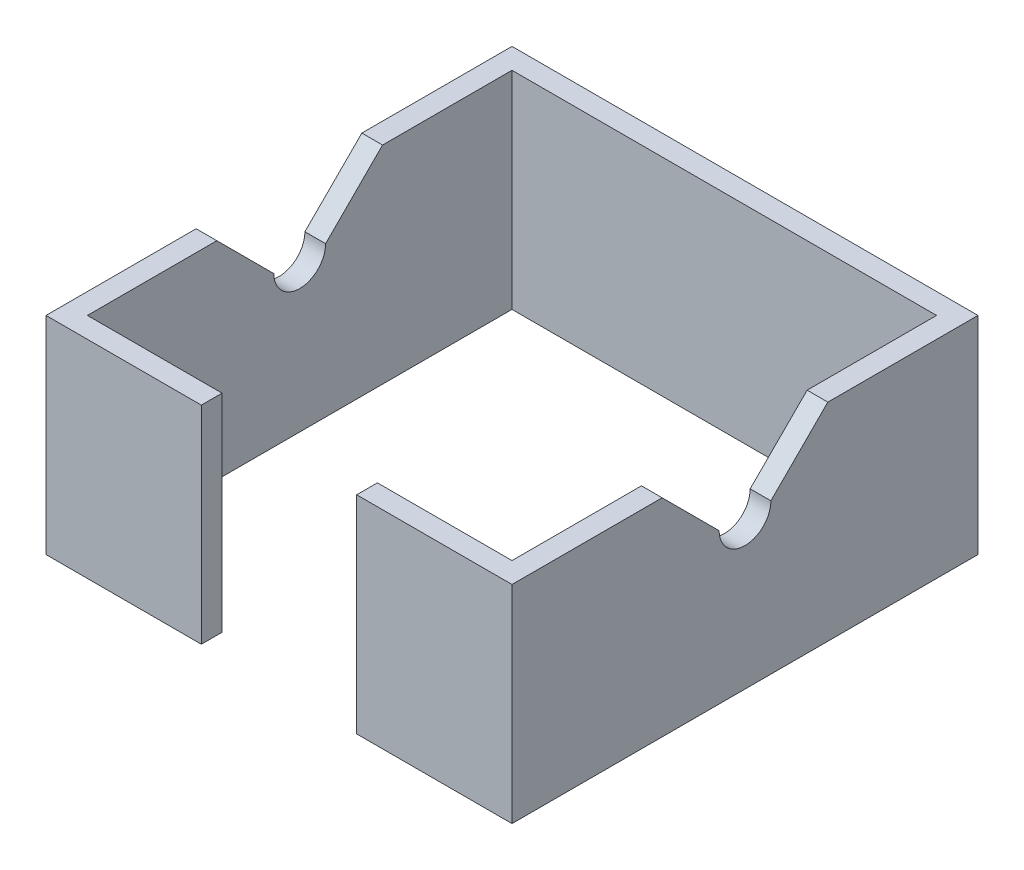
ISO-10303-21;
HEADER;
FILE_DESCRIPTION(('STEP AP214'),'2;1');
FILE_NAME('part.step','',(''),(''),'','','');
FILE_SCHEMA(('AUTOMOTIVE_DESIGN { 1 0 10303 214 1 1 1 1 }'));
ENDSEC;
DATA;
#1=APPLICATION_CONTEXT('core data for automotive mechanical design processes');
#2=APPLICATION_PROTOCOL_DEFINITION('international standard','automotive_design',2000,#1);
#3=PRODUCT_CONTEXT('',#1,'mechanical');
#4=PRODUCT('Part','Part','',(#3));
#5=PRODUCT_RELATED_PRODUCT_CATEGORY('part','',(#4));
#6=PRODUCT_DEFINITION_FORMATION('','',#4);
#7=PRODUCT_DEFINITION_CONTEXT('part definition',#1,'design');
#8=PRODUCT_DEFINITION('design','',#6,#7);
#9=PRODUCT_DEFINITION_SHAPE('','',#8);
#10=(LENGTH_UNIT() NAMED_UNIT(*) SI_UNIT(.MILLI.,.METRE.));
#11=(NAMED_UNIT(*) PLANE_ANGLE_UNIT() SI_UNIT($,.RADIAN.));
#12=(NAMED_UNIT(*) SI_UNIT($,.STERADIAN.) SOLID_ANGLE_UNIT());
#13=UNCERTAINTY_MEASURE_WITH_UNIT(LENGTH_MEASURE(1.E-05),#10,'distance_accuracy_value','');
#14=(GEOMETRIC_REPRESENTATION_CONTEXT(3) GLOBAL_UNCERTAINTY_ASSIGNED_CONTEXT((#13)) GLOBAL_UNIT_ASSIGNED_CONTEXT((#10,
#11,#12)) REPRESENTATION_CONTEXT('',''));
#15=CARTESIAN_POINT('',(0.,0.,0.));
#16=DIRECTION('',(0.,0.,1.));
#17=DIRECTION('',(1.,0.,0.));
#18=AXIS2_PLACEMENT_3D('',#15,#16,#17);
#19=CARTESIAN_POINT('',(0.,20.,0.));
#20=DIRECTION('',(0.,1.,0.));
#21=DIRECTION('',(0.,0.,1.));
#22=AXIS2_PLACEMENT_3D('',#19,#20,#21);
#23=PLANE('',#22);
#24=DIRECTION('',(0.,0.,1.));
#25=VECTOR('',#24,1.);
#26=CARTESIAN_POINT('',(0.,20.,0.));
#27=LINE('',#26,#25);
#28=CARTESIAN_POINT('',(0.,20.,0.));
#29=VERTEX_POINT('',#28);
#30=CARTESIAN_POINT('',(0.,20.,14.4999999999999));
#31=VERTEX_POINT('',#30);
#32=EDGE_CURVE('E174',#29,#31,#27,.T.);
#33=ORIENTED_EDGE('',*,*,#32,.T.);
#34=DIRECTION('',(-1.,0.,0.));
#35=VECTOR('',#34,1.);
#36=CARTESIAN_POINT('',(45.,20.,14.4999999999999));
#37=LINE('',#36,#35);
#38=CARTESIAN_POINT('',(2.,20.,14.4999999999999));
#39=VERTEX_POINT('',#38);
#40=EDGE_CURVE('E244',#39,#31,#37,.T.);
#41=ORIENTED_EDGE('',*,*,#40,.F.);
#42=DIRECTION('',(0.,0.,1.));
#43=VECTOR('',#42,1.);
#44=CARTESIAN_POINT('',(2.,20.,2.));
#45=LINE('',#44,#43);
#46=CARTESIAN_POINT('',(2.,20.,2.));
#47=VERTEX_POINT('',#46);
#48=EDGE_CURVE('E134',#47,#39,#45,.T.);
#49=ORIENTED_EDGE('',*,*,#48,.F.);
#50=DIRECTION('',(-1.,0.,0.));
#51=VECTOR('',#50,1.);
#52=CARTESIAN_POINT('',(2.,20.,2.));
#53=LINE('',#52,#51);
#54=CARTESIAN_POINT('',(43.,20.,2.));
#55=VERTEX_POINT('',#54);
#56=EDGE_CURVE('E146',#55,#47,#53,.T.);
#57=ORIENTED_EDGE('',*,*,#56,.F.);
#58=DIRECTION('',(0.,0.,-1.));
#59=VECTOR('',#58,1.);
#60=CARTESIAN_POINT('',(43.,20.,2.));
#61=LINE('',#60,#59);
#62=CARTESIAN_POINT('',(43.,20.,14.4999999999999));
#63=VERTEX_POINT('',#62);
#64=EDGE_CURVE('E142',#63,#55,#61,.T.);
#65=ORIENTED_EDGE('',*,*,#64,.F.);
#66=CARTESIAN_POINT('',(45.,20.,14.4999999999999));
#67=VERTEX_POINT('',#66);
#68=EDGE_CURVE('E246',#67,#63,#37,.T.);
#69=ORIENTED_EDGE('',*,*,#68,.F.);
#70=DIRECTION('',(0.,0.,-1.));
#71=VECTOR('',#70,1.);
#72=CARTESIAN_POINT('',(45.,20.,0.));
#73=LINE('',#72,#71);
#74=CARTESIAN_POINT('',(45.,20.,0.));
#75=VERTEX_POINT('',#74);
#76=EDGE_CURVE('E181',#67,#75,#73,.T.);
#77=ORIENTED_EDGE('',*,*,#76,.T.);
#78=DIRECTION('',(-1.,0.,0.));
#79=VECTOR('',#78,1.);
#80=CARTESIAN_POINT('',(0.,20.,0.));
#81=LINE('',#80,#79);
#82=EDGE_CURVE('E185',#75,#29,#81,.T.);
#83=ORIENTED_EDGE('',*,*,#82,.T.);
#84=EDGE_LOOP('',(#33,#41,#49,#57,#65,#69,#77,#83));
#85=FACE_BOUND('',#84,.T.);
#86=ADVANCED_FACE('F39',(#85),#23,.T.);
#87=DIRECTION('',(-1.,0.,0.));
#88=VECTOR('',#87,1.);
#89=CARTESIAN_POINT('',(45.,20.,30.5));
#90=LINE('',#89,#88);
#91=CARTESIAN_POINT('',(2.,20.,30.5000000000001));
#92=VERTEX_POINT('',#91);
#93=CARTESIAN_POINT('',(0.,20.,30.5));
#94=VERTEX_POINT('',#93);
#95=EDGE_CURVE('E57',#92,#94,#90,.T.);
#96=ORIENTED_EDGE('',*,*,#95,.T.);
#97=CARTESIAN_POINT('',(0.,20.,45.));
#98=VERTEX_POINT('',#97);
#99=EDGE_CURVE('E100',#94,#98,#27,.T.);
#100=ORIENTED_EDGE('',*,*,#99,.T.);
#101=DIRECTION('',(1.,0.,0.));
#102=VECTOR('',#101,1.);
#103=CARTESIAN_POINT('',(0.,20.,45.));
#104=LINE('',#103,#102);
#105=CARTESIAN_POINT('',(15.,20.,45.));
#106=VERTEX_POINT('',#105);
#107=EDGE_CURVE('E178',#98,#106,#104,.T.);
#108=ORIENTED_EDGE('',*,*,#107,.T.);
#109=DIRECTION('',(0.,0.,1.));
#110=VECTOR('',#109,1.);
#111=CARTESIAN_POINT('',(15.,20.,-0.001000000000001));
#112=LINE('',#111,#110);
#113=CARTESIAN_POINT('',(15.,20.,43.));
#114=VERTEX_POINT('',#113);
#115=EDGE_CURVE('E117',#114,#106,#112,.T.);
#116=ORIENTED_EDGE('',*,*,#115,.F.);
#117=DIRECTION('',(1.,0.,0.));
#118=VECTOR('',#117,1.);
#119=CARTESIAN_POINT('',(2.00000000000001,20.,43.));
#120=LINE('',#119,#118);
#121=CARTESIAN_POINT('',(2.00000000000001,20.,43.));
#122=VERTEX_POINT('',#121);
#123=EDGE_CURVE('E139',#122,#114,#120,.T.);
#124=ORIENTED_EDGE('',*,*,#123,.F.);
#125=EDGE_CURVE('E138',#92,#122,#45,.T.);
#126=ORIENTED_EDGE('',*,*,#125,.F.);
#127=EDGE_LOOP('',(#96,#100,#108,#116,#124,#126));
#128=FACE_BOUND('',#127,.T.);
#129=ADVANCED_FACE('F361',(#128),#23,.T.);
#130=CARTESIAN_POINT('',(0.,20.,0.));
#131=DIRECTION('',(1.,0.,0.));
#132=DIRECTION('',(0.,0.,-1.));
#133=AXIS2_PLACEMENT_3D('',#130,#131,#132);
#134=PLANE('',#133);
#135=DIRECTION('',(0.,-0.707106781186544,0.707106781186551));
#136=VECTOR('',#135,1.);
#137=CARTESIAN_POINT('',(0.,27.25,7.2499999999999));
#138=LINE('',#137,#136);
#139=CARTESIAN_POINT('',(0.,14.5,20.));
#140=VERTEX_POINT('',#139);
#141=EDGE_CURVE('E70',#31,#140,#138,.T.);
#142=ORIENTED_EDGE('',*,*,#141,.F.);
#143=ORIENTED_EDGE('',*,*,#32,.F.);
#144=DIRECTION('',(0.,-1.,0.));
#145=VECTOR('',#144,1.);
#146=CARTESIAN_POINT('',(0.,20.,0.));
#147=LINE('',#146,#145);
#148=CARTESIAN_POINT('',(0.,0.,0.));
#149=VERTEX_POINT('',#148);
#150=EDGE_CURVE('E188',#29,#149,#147,.T.);
#151=ORIENTED_EDGE('',*,*,#150,.T.);
#152=DIRECTION('',(0.,0.,1.));
#153=VECTOR('',#152,1.);
#154=CARTESIAN_POINT('',(0.,0.,0.));
#155=LINE('',#154,#153);
#156=CARTESIAN_POINT('',(0.,0.,45.));
#157=VERTEX_POINT('',#156);
#158=EDGE_CURVE('E173',#149,#157,#155,.T.);
#159=ORIENTED_EDGE('',*,*,#158,.T.);
#160=DIRECTION('',(0.,-1.,0.));
#161=VECTOR('',#160,1.);
#162=CARTESIAN_POINT('',(0.,20.,45.));
#163=LINE('',#162,#161);
#164=EDGE_CURVE('E209',#98,#157,#163,.T.);
#165=ORIENTED_EDGE('',*,*,#164,.F.);
#166=ORIENTED_EDGE('',*,*,#99,.F.);
#167=DIRECTION('',(0.,-0.707106781186544,-0.707106781186551));
#168=VECTOR('',#167,1.);
#169=CARTESIAN_POINT('',(0.,4.74999999999998,15.2499999999999));
#170=LINE('',#169,#168);
#171=CARTESIAN_POINT('',(0.,14.5,25.));
#172=VERTEX_POINT('',#171);
#173=EDGE_CURVE('E82',#94,#172,#170,.T.);
#174=ORIENTED_EDGE('',*,*,#173,.T.);
#175=CARTESIAN_POINT('',(0.,14.5,22.5));
#176=DIRECTION('',(-1.,0.,0.));
#177=DIRECTION('',(0.,0.,1.));
#178=AXIS2_PLACEMENT_3D('',#175,#176,#177);
#179=CIRCLE('',#178,2.5);
#180=EDGE_CURVE('E43',#140,#172,#179,.T.);
#181=ORIENTED_EDGE('',*,*,#180,.F.);
#182=EDGE_LOOP('',(#142,#143,#151,#159,#165,#166,#174,#181));
#183=FACE_BOUND('',#182,.T.);
#184=ADVANCED_FACE('F41',(#183),#134,.F.);
#185=CARTESIAN_POINT('',(45.,20.,0.));
#186=DIRECTION('',(-1.,0.,0.));
#187=DIRECTION('',(0.,0.,1.));
#188=AXIS2_PLACEMENT_3D('',#185,#186,#187);
#189=PLANE('',#188);
#190=DIRECTION('',(0.,0.707106781186544,-0.707106781186551));
#191=VECTOR('',#190,1.);
#192=CARTESIAN_POINT('',(45.,17.2500000000001,17.2499999999999));
#193=LINE('',#192,#191);
#194=CARTESIAN_POINT('',(45.,14.5,20.));
#195=VERTEX_POINT('',#194);
#196=EDGE_CURVE('E89',#195,#67,#193,.T.);
#197=ORIENTED_EDGE('',*,*,#196,.F.);
#198=CARTESIAN_POINT('',(45.,14.5,22.5));
#199=DIRECTION('',(-1.,0.,0.));
#200=DIRECTION('',(0.,0.,1.));
#201=AXIS2_PLACEMENT_3D('',#198,#199,#200);
#202=CIRCLE('',#201,2.5);
#203=CARTESIAN_POINT('',(45.,14.5,25.));
#204=VERTEX_POINT('',#203);
#205=EDGE_CURVE('E380',#195,#204,#202,.T.);
#206=ORIENTED_EDGE('',*,*,#205,.T.);
#207=DIRECTION('',(0.,0.707106781186544,0.707106781186551));
#208=VECTOR('',#207,1.);
#209=CARTESIAN_POINT('',(45.,-5.24999999999994,5.24999999999988));
#210=LINE('',#209,#208);
#211=CARTESIAN_POINT('',(45.,20.,30.5));
#212=VERTEX_POINT('',#211);
#213=EDGE_CURVE('E379',#204,#212,#210,.T.);
#214=ORIENTED_EDGE('',*,*,#213,.T.);
#215=CARTESIAN_POINT('',(45.,20.,45.));
#216=VERTEX_POINT('',#215);
#217=EDGE_CURVE('E182',#216,#212,#73,.T.);
#218=ORIENTED_EDGE('',*,*,#217,.F.);
#219=DIRECTION('',(0.,-1.,0.));
#220=VECTOR('',#219,1.);
#221=CARTESIAN_POINT('',(45.,20.,45.));
#222=LINE('',#221,#220);
#223=CARTESIAN_POINT('',(45.,0.,45.));
#224=VERTEX_POINT('',#223);
#225=EDGE_CURVE('E206',#216,#224,#222,.T.);
#226=ORIENTED_EDGE('',*,*,#225,.T.);
#227=DIRECTION('',(0.,0.,-1.));
#228=VECTOR('',#227,1.);
#229=CARTESIAN_POINT('',(45.,0.,0.));
#230=LINE('',#229,#228);
#231=CARTESIAN_POINT('',(45.,0.,0.));
#232=VERTEX_POINT('',#231);
#233=EDGE_CURVE('E195',#224,#232,#230,.T.);
#234=ORIENTED_EDGE('',*,*,#233,.T.);
#235=DIRECTION('',(0.,-1.,0.));
#236=VECTOR('',#235,1.);
#237=CARTESIAN_POINT('',(45.,20.,0.));
#238=LINE('',#237,#236);
#239=EDGE_CURVE('E203',#75,#232,#238,.T.);
#240=ORIENTED_EDGE('',*,*,#239,.F.);
#241=ORIENTED_EDGE('',*,*,#76,.F.);
#242=EDGE_LOOP('',(#197,#206,#214,#218,#226,#234,#240,#241));
#243=FACE_BOUND('',#242,.T.);
#244=ADVANCED_FACE('F377',(#243),#189,.F.);
#245=CARTESIAN_POINT('',(2.,20.,2.));
#246=DIRECTION('',(1.,0.,0.));
#247=DIRECTION('',(0.,0.,-1.));
#248=AXIS2_PLACEMENT_3D('',#245,#246,#247);
#249=PLANE('',#248);
#250=ORIENTED_EDGE('',*,*,#48,.T.);
#251=DIRECTION('',(0.,-0.707106781186544,0.707106781186551));
#252=VECTOR('',#251,1.);
#253=CARTESIAN_POINT('',(2.,26.25,8.24999999999991));
#254=LINE('',#253,#252);
#255=CARTESIAN_POINT('',(2.,14.5,20.));
#256=VERTEX_POINT('',#255);
#257=EDGE_CURVE('E101',#39,#256,#254,.T.);
#258=ORIENTED_EDGE('',*,*,#257,.T.);
#259=CARTESIAN_POINT('',(2.,14.5,22.5));
#260=DIRECTION('',(1.,0.,0.));
#261=DIRECTION('',(0.,0.,-1.));
#262=AXIS2_PLACEMENT_3D('',#259,#260,#261);
#263=CIRCLE('',#262,2.5);
#264=CARTESIAN_POINT('',(2.,14.5,25.));
#265=VERTEX_POINT('',#264);
#266=EDGE_CURVE('E96',#265,#256,#263,.T.);
#267=ORIENTED_EDGE('',*,*,#266,.F.);
#268=DIRECTION('',(0.,-0.707106781186544,-0.707106781186551));
#269=VECTOR('',#268,1.);
#270=CARTESIAN_POINT('',(2.,5.74999999999998,16.2499999999999));
#271=LINE('',#270,#269);
#272=EDGE_CURVE('E84',#92,#265,#271,.T.);
#273=ORIENTED_EDGE('',*,*,#272,.F.);
#274=ORIENTED_EDGE('',*,*,#125,.T.);
#275=DIRECTION('',(0.,-1.,0.));
#276=VECTOR('',#275,1.);
#277=CARTESIAN_POINT('',(2.00000000000001,20.,43.));
#278=LINE('',#277,#276);
#279=CARTESIAN_POINT('',(2.00000000000001,0.,43.));
#280=VERTEX_POINT('',#279);
#281=EDGE_CURVE('E170',#122,#280,#278,.T.);
#282=ORIENTED_EDGE('',*,*,#281,.T.);
#283=DIRECTION('',(0.,0.,1.));
#284=VECTOR('',#283,1.);
#285=CARTESIAN_POINT('',(2.,0.,2.));
#286=LINE('',#285,#284);
#287=CARTESIAN_POINT('',(2.,0.,2.));
#288=VERTEX_POINT('',#287);
#289=EDGE_CURVE('E113',#288,#280,#286,.T.);
#290=ORIENTED_EDGE('',*,*,#289,.F.);
#291=DIRECTION('',(0.,-1.,0.));
#292=VECTOR('',#291,1.);
#293=CARTESIAN_POINT('',(2.,20.,2.));
#294=LINE('',#293,#292);
#295=EDGE_CURVE('E149',#47,#288,#294,.T.);
#296=ORIENTED_EDGE('',*,*,#295,.F.);
#297=EDGE_LOOP('',(#250,#258,#267,#273,#274,#282,#290,#296));
#298=FACE_BOUND('',#297,.T.);
#299=ADVANCED_FACE('F287',(#298),#249,.T.);
#300=CARTESIAN_POINT('',(43.,20.,2.));
#301=DIRECTION('',(-1.,0.,0.));
#302=DIRECTION('',(0.,0.,1.));
#303=AXIS2_PLACEMENT_3D('',#300,#301,#302);
#304=PLANE('',#303);
#305=CARTESIAN_POINT('',(43.,14.5,22.5));
#306=DIRECTION('',(-1.,0.,0.));
#307=DIRECTION('',(0.,0.,1.));
#308=AXIS2_PLACEMENT_3D('',#305,#306,#307);
#309=CIRCLE('',#308,2.5);
#310=CARTESIAN_POINT('',(43.,14.5,20.));
#311=VERTEX_POINT('',#310);
#312=CARTESIAN_POINT('',(43.,14.5,25.));
#313=VERTEX_POINT('',#312);
#314=EDGE_CURVE('E49',#311,#313,#309,.T.);
#315=ORIENTED_EDGE('',*,*,#314,.F.);
#316=DIRECTION('',(0.,0.707106781186544,-0.707106781186551));
#317=VECTOR('',#316,1.);
#318=CARTESIAN_POINT('',(43.,26.25,8.2499999999999));
#319=LINE('',#318,#317);
#320=EDGE_CURVE('E11',#311,#63,#319,.T.);
#321=ORIENTED_EDGE('',*,*,#320,.T.);
#322=ORIENTED_EDGE('',*,*,#64,.T.);
#323=DIRECTION('',(0.,-1.,0.));
#324=VECTOR('',#323,1.);
#325=CARTESIAN_POINT('',(43.,20.,2.));
#326=LINE('',#325,#324);
#327=CARTESIAN_POINT('',(43.,0.,2.));
#328=VERTEX_POINT('',#327);
#329=EDGE_CURVE('E164',#55,#328,#326,.T.);
#330=ORIENTED_EDGE('',*,*,#329,.T.);
#331=DIRECTION('',(0.,0.,-1.));
#332=VECTOR('',#331,1.);
#333=CARTESIAN_POINT('',(43.,0.,2.));
#334=LINE('',#333,#332);
#335=CARTESIAN_POINT('',(43.,0.,43.));
#336=VERTEX_POINT('',#335);
#337=EDGE_CURVE('E156',#336,#328,#334,.T.);
#338=ORIENTED_EDGE('',*,*,#337,.F.);
#339=DIRECTION('',(0.,-1.,0.));
#340=VECTOR('',#339,1.);
#341=CARTESIAN_POINT('',(43.,20.,43.));
#342=LINE('',#341,#340);
#343=CARTESIAN_POINT('',(43.,20.,43.));
#344=VERTEX_POINT('',#343);
#345=EDGE_CURVE('E167',#344,#336,#342,.T.);
#346=ORIENTED_EDGE('',*,*,#345,.F.);
#347=CARTESIAN_POINT('',(43.,20.,30.5));
#348=VERTEX_POINT('',#347);
#349=EDGE_CURVE('E143',#344,#348,#61,.T.);
#350=ORIENTED_EDGE('',*,*,#349,.T.);
#351=DIRECTION('',(0.,0.707106781186544,0.707106781186551));
#352=VECTOR('',#351,1.);
#353=CARTESIAN_POINT('',(43.,5.74999999999998,16.2499999999999));
#354=LINE('',#353,#352);
#355=EDGE_CURVE('E212',#313,#348,#354,.T.);
#356=ORIENTED_EDGE('',*,*,#355,.F.);
#357=EDGE_LOOP('',(#315,#321,#322,#330,#338,#346,#350,#356));
#358=FACE_BOUND('',#357,.T.);
#359=ADVANCED_FACE('F226',(#358),#304,.T.);
#360=CARTESIAN_POINT('',(0.,20.,45.));
#361=DIRECTION('',(0.,0.,-1.));
#362=DIRECTION('',(-1.,0.,0.));
#363=AXIS2_PLACEMENT_3D('',#360,#361,#362);
#364=PLANE('',#363);
#365=CARTESIAN_POINT('',(30.,20.,45.));
#366=VERTEX_POINT('',#365);
#367=EDGE_CURVE('E177',#366,#216,#104,.T.);
#368=ORIENTED_EDGE('',*,*,#367,.F.);
#369=DIRECTION('',(0.,1.,0.));
#370=VECTOR('',#369,1.);
#371=CARTESIAN_POINT('',(30.,20.,45.));
#372=LINE('',#371,#370);
#373=CARTESIAN_POINT('',(30.,0.,45.));
#374=VERTEX_POINT('',#373);
#375=EDGE_CURVE('E114',#374,#366,#372,.T.);
#376=ORIENTED_EDGE('',*,*,#375,.F.);
#377=DIRECTION('',(1.,0.,0.));
#378=VECTOR('',#377,1.);
#379=CARTESIAN_POINT('',(0.,0.,45.));
#380=LINE('',#379,#378);
#381=EDGE_CURVE('E191',#374,#224,#380,.T.);
#382=ORIENTED_EDGE('',*,*,#381,.T.);
#383=ORIENTED_EDGE('',*,*,#225,.F.);
#384=EDGE_LOOP('',(#368,#376,#382,#383));
#385=FACE_BOUND('',#384,.T.);
#386=ADVANCED_FACE('F348',(#385),#364,.F.);
#387=CARTESIAN_POINT('',(2.00000000000001,20.,43.));
#388=DIRECTION('',(0.,0.,-1.));
#389=DIRECTION('',(-1.,0.,0.));
#390=AXIS2_PLACEMENT_3D('',#387,#388,#389);
#391=PLANE('',#390);
#392=DIRECTION('',(0.,1.,0.));
#393=VECTOR('',#392,1.);
#394=CARTESIAN_POINT('',(30.,20.,43.));
#395=LINE('',#394,#393);
#396=CARTESIAN_POINT('',(30.,0.,43.));
#397=VERTEX_POINT('',#396);
#398=CARTESIAN_POINT('',(30.,20.,43.));
#399=VERTEX_POINT('',#398);
#400=EDGE_CURVE('E95',#397,#399,#395,.T.);
#401=ORIENTED_EDGE('',*,*,#400,.T.);
#402=EDGE_CURVE('E137',#399,#344,#120,.T.);
#403=ORIENTED_EDGE('',*,*,#402,.T.);
#404=ORIENTED_EDGE('',*,*,#345,.T.);
#405=DIRECTION('',(1.,0.,0.));
#406=VECTOR('',#405,1.);
#407=CARTESIAN_POINT('',(2.00000000000001,0.,43.));
#408=LINE('',#407,#406);
#409=EDGE_CURVE('E152',#397,#336,#408,.T.);
#410=ORIENTED_EDGE('',*,*,#409,.F.);
#411=EDGE_LOOP('',(#401,#403,#404,#410));
#412=FACE_BOUND('',#411,.T.);
#413=ADVANCED_FACE('F339',(#412),#391,.T.);
#414=EDGE_CURVE('E234',#212,#348,#90,.T.);
#415=ORIENTED_EDGE('',*,*,#414,.T.);
#416=ORIENTED_EDGE('',*,*,#349,.F.);
#417=ORIENTED_EDGE('',*,*,#402,.F.);
#418=DIRECTION('',(0.,0.,1.));
#419=VECTOR('',#418,1.);
#420=CARTESIAN_POINT('',(30.,20.,-0.001000000000001));
#421=LINE('',#420,#419);
#422=EDGE_CURVE('E120',#399,#366,#421,.T.);
#423=ORIENTED_EDGE('',*,*,#422,.T.);
#424=ORIENTED_EDGE('',*,*,#367,.T.);
#425=ORIENTED_EDGE('',*,*,#217,.T.);
#426=EDGE_LOOP('',(#415,#416,#417,#423,#424,#425));
#427=FACE_BOUND('',#426,.T.);
#428=ADVANCED_FACE('F239',(#427),#23,.T.);
#429=CARTESIAN_POINT('',(0.,0.,0.));
#430=DIRECTION('',(0.,1.,0.));
#431=DIRECTION('',(0.,0.,1.));
#432=AXIS2_PLACEMENT_3D('',#429,#430,#431);
#433=PLANE('',#432);
#434=ORIENTED_EDGE('',*,*,#381,.F.);
#435=DIRECTION('',(0.,0.,1.));
#436=VECTOR('',#435,1.);
#437=CARTESIAN_POINT('',(30.,0.,-0.001000000000001));
#438=LINE('',#437,#436);
#439=EDGE_CURVE('E125',#397,#374,#438,.T.);
#440=ORIENTED_EDGE('',*,*,#439,.F.);
#441=ORIENTED_EDGE('',*,*,#409,.T.);
#442=ORIENTED_EDGE('',*,*,#337,.T.);
#443=DIRECTION('',(-1.,0.,0.));
#444=VECTOR('',#443,1.);
#445=CARTESIAN_POINT('',(2.,0.,2.));
#446=LINE('',#445,#444);
#447=EDGE_CURVE('E159',#328,#288,#446,.T.);
#448=ORIENTED_EDGE('',*,*,#447,.T.);
#449=ORIENTED_EDGE('',*,*,#289,.T.);
#450=CARTESIAN_POINT('',(15.,0.,43.));
#451=VERTEX_POINT('',#450);
#452=EDGE_CURVE('E153',#280,#451,#408,.T.);
#453=ORIENTED_EDGE('',*,*,#452,.T.);
#454=DIRECTION('',(0.,0.,1.));
#455=VECTOR('',#454,1.);
#456=CARTESIAN_POINT('',(15.,0.,-0.001000000000001));
#457=LINE('',#456,#455);
#458=CARTESIAN_POINT('',(15.,0.,45.));
#459=VERTEX_POINT('',#458);
#460=EDGE_CURVE('E124',#451,#459,#457,.T.);
#461=ORIENTED_EDGE('',*,*,#460,.T.);
#462=EDGE_CURVE('E192',#157,#459,#380,.T.);
#463=ORIENTED_EDGE('',*,*,#462,.F.);
#464=ORIENTED_EDGE('',*,*,#158,.F.);
#465=DIRECTION('',(-1.,0.,0.));
#466=VECTOR('',#465,1.);
#467=CARTESIAN_POINT('',(0.,0.,0.));
#468=LINE('',#467,#466);
#469=EDGE_CURVE('E198',#232,#149,#468,.T.);
#470=ORIENTED_EDGE('',*,*,#469,.F.);
#471=ORIENTED_EDGE('',*,*,#233,.F.);
#472=EDGE_LOOP('',(#434,#440,#441,#442,#448,#449,#453,#461,#463,#464,#470,#471));
#473=FACE_BOUND('',#472,.T.);
#474=ADVANCED_FACE('F295',(#473),#433,.F.);
#475=ORIENTED_EDGE('',*,*,#462,.T.);
#476=DIRECTION('',(0.,-1.,0.));
#477=VECTOR('',#476,1.);
#478=CARTESIAN_POINT('',(15.,20.,45.));
#479=LINE('',#478,#477);
#480=EDGE_CURVE('E110',#106,#459,#479,.T.);
#481=ORIENTED_EDGE('',*,*,#480,.F.);
#482=ORIENTED_EDGE('',*,*,#107,.F.);
#483=ORIENTED_EDGE('',*,*,#164,.T.);
#484=EDGE_LOOP('',(#475,#481,#482,#483));
#485=FACE_BOUND('',#484,.T.);
#486=ADVANCED_FACE('F367',(#485),#364,.F.);
#487=CARTESIAN_POINT('',(0.,20.,0.));
#488=DIRECTION('',(0.,0.,1.));
#489=DIRECTION('',(1.,0.,0.));
#490=AXIS2_PLACEMENT_3D('',#487,#488,#489);
#491=PLANE('',#490);
#492=ORIENTED_EDGE('',*,*,#469,.T.);
#493=ORIENTED_EDGE('',*,*,#150,.F.);
#494=ORIENTED_EDGE('',*,*,#82,.F.);
#495=ORIENTED_EDGE('',*,*,#239,.T.);
#496=EDGE_LOOP('',(#492,#493,#494,#495));
#497=FACE_BOUND('',#496,.T.);
#498=ADVANCED_FACE('F374',(#497),#491,.F.);
#499=DIRECTION('',(0.,-1.,0.));
#500=VECTOR('',#499,1.);
#501=CARTESIAN_POINT('',(15.,20.,43.));
#502=LINE('',#501,#500);
#503=EDGE_CURVE('E121',#114,#451,#502,.T.);
#504=ORIENTED_EDGE('',*,*,#503,.T.);
#505=ORIENTED_EDGE('',*,*,#452,.F.);
#506=ORIENTED_EDGE('',*,*,#281,.F.);
#507=ORIENTED_EDGE('',*,*,#123,.T.);
#508=EDGE_LOOP('',(#504,#505,#506,#507));
#509=FACE_BOUND('',#508,.T.);
#510=ADVANCED_FACE('F359',(#509),#391,.T.);
#511=CARTESIAN_POINT('',(2.,20.,2.));
#512=DIRECTION('',(0.,0.,1.));
#513=DIRECTION('',(1.,0.,0.));
#514=AXIS2_PLACEMENT_3D('',#511,#512,#513);
#515=PLANE('',#514);
#516=ORIENTED_EDGE('',*,*,#447,.F.);
#517=ORIENTED_EDGE('',*,*,#329,.F.);
#518=ORIENTED_EDGE('',*,*,#56,.T.);
#519=ORIENTED_EDGE('',*,*,#295,.T.);
#520=EDGE_LOOP('',(#516,#517,#518,#519));
#521=FACE_BOUND('',#520,.T.);
#522=ADVANCED_FACE('F282',(#521),#515,.T.);
#523=CARTESIAN_POINT('',(15.,20.,-0.001000000000001));
#524=DIRECTION('',(-1.,0.,0.));
#525=DIRECTION('',(0.,0.,1.));
#526=AXIS2_PLACEMENT_3D('',#523,#524,#525);
#527=PLANE('',#526);
#528=ORIENTED_EDGE('',*,*,#115,.T.);
#529=ORIENTED_EDGE('',*,*,#480,.T.);
#530=ORIENTED_EDGE('',*,*,#460,.F.);
#531=ORIENTED_EDGE('',*,*,#503,.F.);
#532=EDGE_LOOP('',(#528,#529,#530,#531));
#533=FACE_BOUND('',#532,.T.);
#534=ADVANCED_FACE('F365',(#533),#527,.F.);
#535=CARTESIAN_POINT('',(30.,20.,-0.001000000000001));
#536=DIRECTION('',(1.,0.,0.));
#537=DIRECTION('',(0.,0.,-1.));
#538=AXIS2_PLACEMENT_3D('',#535,#536,#537);
#539=PLANE('',#538);
#540=ORIENTED_EDGE('',*,*,#439,.T.);
#541=ORIENTED_EDGE('',*,*,#375,.T.);
#542=ORIENTED_EDGE('',*,*,#422,.F.);
#543=ORIENTED_EDGE('',*,*,#400,.F.);
#544=EDGE_LOOP('',(#540,#541,#542,#543));
#545=FACE_BOUND('',#544,.T.);
#546=ADVANCED_FACE('F331',(#545),#539,.F.);
#547=CARTESIAN_POINT('',(45.,-5.24999999999994,5.24999999999988));
#548=DIRECTION('',(0.,-0.707106781186551,0.707106781186544));
#549=DIRECTION('',(0.,-0.707106781186544,-0.707106781186551));
#550=AXIS2_PLACEMENT_3D('',#547,#548,#549);
#551=PLANE('',#550);
#552=ORIENTED_EDGE('',*,*,#355,.T.);
#553=ORIENTED_EDGE('',*,*,#414,.F.);
#554=ORIENTED_EDGE('',*,*,#213,.F.);
#555=DIRECTION('',(-1.,0.,0.));
#556=VECTOR('',#555,1.);
#557=CARTESIAN_POINT('',(45.,14.5,25.));
#558=LINE('',#557,#556);
#559=EDGE_CURVE('E88',#204,#313,#558,.T.);
#560=ORIENTED_EDGE('',*,*,#559,.T.);
#561=EDGE_LOOP('',(#552,#553,#554,#560));
#562=FACE_BOUND('',#561,.T.);
#563=ADVANCED_FACE('F233',(#562),#551,.F.);
#564=CARTESIAN_POINT('',(45.,17.2500000000001,17.2499999999999));
#565=DIRECTION('',(0.,0.707106781186551,0.707106781186544));
#566=DIRECTION('',(0.,-0.707106781186544,0.707106781186551));
#567=AXIS2_PLACEMENT_3D('',#564,#565,#566);
#568=PLANE('',#567);
#569=DIRECTION('',(-1.,0.,0.));
#570=VECTOR('',#569,1.);
#571=CARTESIAN_POINT('',(45.,14.5,20.));
#572=LINE('',#571,#570);
#573=EDGE_CURVE('E105',#195,#311,#572,.T.);
#574=ORIENTED_EDGE('',*,*,#573,.F.);
#575=ORIENTED_EDGE('',*,*,#196,.T.);
#576=ORIENTED_EDGE('',*,*,#68,.T.);
#577=ORIENTED_EDGE('',*,*,#320,.F.);
#578=EDGE_LOOP('',(#574,#575,#576,#577));
#579=FACE_BOUND('',#578,.T.);
#580=ADVANCED_FACE('F260',(#579),#568,.T.);
#581=CARTESIAN_POINT('',(45.,14.5,22.5));
#582=DIRECTION('',(-1.,0.,0.));
#583=DIRECTION('',(0.,0.,1.));
#584=AXIS2_PLACEMENT_3D('',#581,#582,#583);
#585=CYLINDRICAL_SURFACE('',#584,2.5);
#586=ORIENTED_EDGE('',*,*,#314,.T.);
#587=ORIENTED_EDGE('',*,*,#559,.F.);
#588=ORIENTED_EDGE('',*,*,#205,.F.);
#589=ORIENTED_EDGE('',*,*,#573,.T.);
#590=EDGE_LOOP('',(#586,#587,#588,#589));
#591=FACE_BOUND('',#590,.T.);
#592=ADVANCED_FACE('F220',(#591),#585,.F.);
#593=EDGE_CURVE('E77',#265,#172,#558,.T.);
#594=ORIENTED_EDGE('',*,*,#593,.F.);
#595=ORIENTED_EDGE('',*,*,#266,.T.);
#596=EDGE_CURVE('E93',#256,#140,#572,.T.);
#597=ORIENTED_EDGE('',*,*,#596,.T.);
#598=ORIENTED_EDGE('',*,*,#180,.T.);
#599=EDGE_LOOP('',(#594,#595,#597,#598));
#600=FACE_BOUND('',#599,.T.);
#601=ADVANCED_FACE('F92',(#600),#585,.F.);
#602=ORIENTED_EDGE('',*,*,#141,.T.);
#603=ORIENTED_EDGE('',*,*,#596,.F.);
#604=ORIENTED_EDGE('',*,*,#257,.F.);
#605=ORIENTED_EDGE('',*,*,#40,.T.);
#606=EDGE_LOOP('',(#602,#603,#604,#605));
#607=FACE_BOUND('',#606,.T.);
#608=ADVANCED_FACE('F393',(#607),#568,.T.);
#609=ORIENTED_EDGE('',*,*,#95,.F.);
#610=ORIENTED_EDGE('',*,*,#272,.T.);
#611=ORIENTED_EDGE('',*,*,#593,.T.);
#612=ORIENTED_EDGE('',*,*,#173,.F.);
#613=EDGE_LOOP('',(#609,#610,#611,#612));
#614=FACE_BOUND('',#613,.T.);
#615=ADVANCED_FACE('F79',(#614),#551,.F.);
#616=CLOSED_SHELL('',(#86,#129,#184,#244,#299,#359,#386,#413,#428,#474,#486,#498,#510,#522,#534,
#546,#563,#580,#592,#601,#608,#615));
#617=MANIFOLD_SOLID_BREP('B2',#616);
#618=ADVANCED_BREP_SHAPE_REPRESENTATION('',(#18,#617),#14);
#619=SHAPE_DEFINITION_REPRESENTATION(#9,#618);
ENDSEC;
END-ISO-10303-21;
